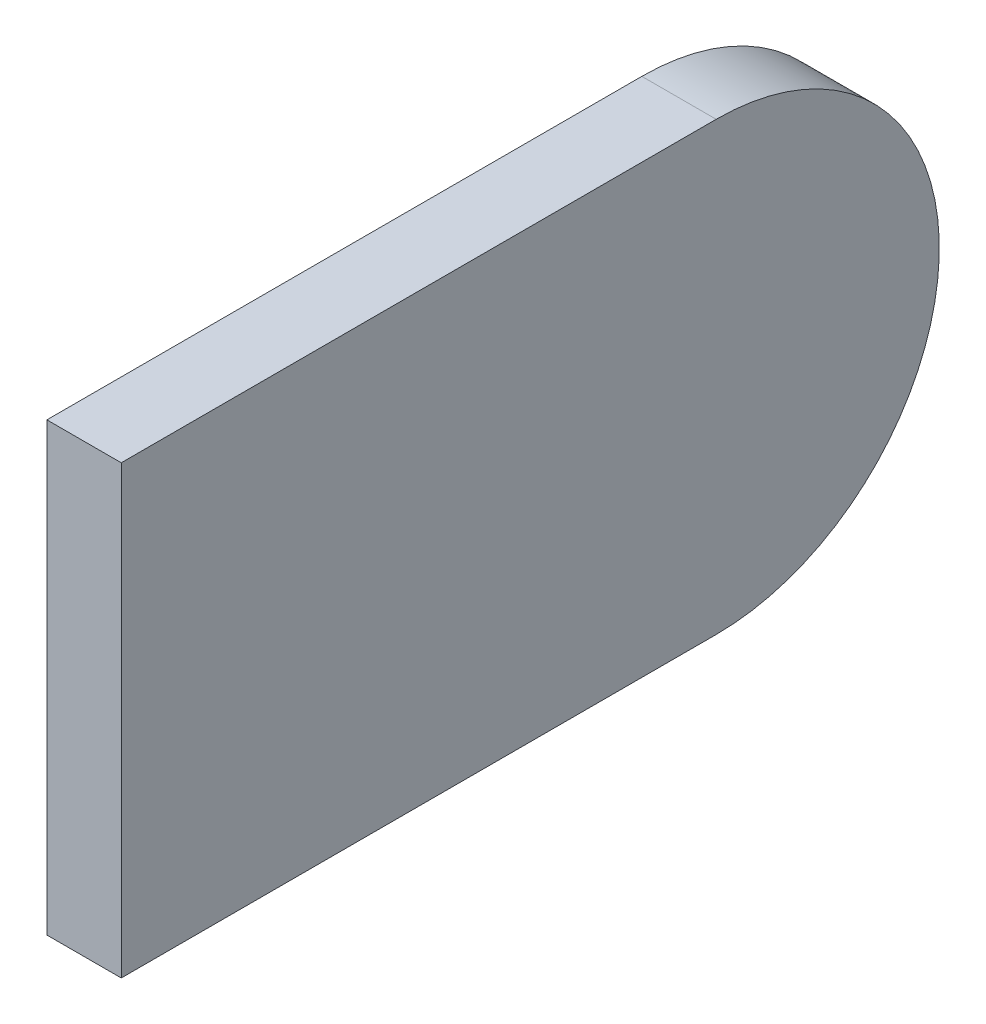
ISO-10303-21;
HEADER;
FILE_DESCRIPTION(('STEP AP214'),'2;1');
FILE_NAME('part.step','',(''),(''),'','','');
FILE_SCHEMA(('AUTOMOTIVE_DESIGN { 1 0 10303 214 1 1 1 1 }'));
ENDSEC;
DATA;
#1=APPLICATION_CONTEXT('core data for automotive mechanical design processes');
#2=APPLICATION_PROTOCOL_DEFINITION('international standard','automotive_design',2000,#1);
#3=PRODUCT_CONTEXT('',#1,'mechanical');
#4=PRODUCT('Part','Part','',(#3));
#5=PRODUCT_RELATED_PRODUCT_CATEGORY('part','',(#4));
#6=PRODUCT_DEFINITION_FORMATION('','',#4);
#7=PRODUCT_DEFINITION_CONTEXT('part definition',#1,'design');
#8=PRODUCT_DEFINITION('design','',#6,#7);
#9=PRODUCT_DEFINITION_SHAPE('','',#8);
#10=(LENGTH_UNIT() NAMED_UNIT(*) SI_UNIT(.MILLI.,.METRE.));
#11=(NAMED_UNIT(*) PLANE_ANGLE_UNIT() SI_UNIT($,.RADIAN.));
#12=(NAMED_UNIT(*) SI_UNIT($,.STERADIAN.) SOLID_ANGLE_UNIT());
#13=UNCERTAINTY_MEASURE_WITH_UNIT(LENGTH_MEASURE(1.E-05),#10,'distance_accuracy_value','');
#14=(GEOMETRIC_REPRESENTATION_CONTEXT(3) GLOBAL_UNCERTAINTY_ASSIGNED_CONTEXT((#13)) GLOBAL_UNIT_ASSIGNED_CONTEXT((#10,
#11,#12)) REPRESENTATION_CONTEXT('',''));
#15=CARTESIAN_POINT('',(0.,0.,0.));
#16=DIRECTION('',(0.,0.,1.));
#17=DIRECTION('',(1.,0.,0.));
#18=AXIS2_PLACEMENT_3D('',#15,#16,#17);
#19=CARTESIAN_POINT('',(10.,0.,-80.));
#20=DIRECTION('',(0.,1.,0.));
#21=DIRECTION('',(0.,0.,1.));
#22=AXIS2_PLACEMENT_3D('',#19,#20,#21);
#23=PLANE('',#22);
#24=DIRECTION('',(0.,0.,-1.));
#25=VECTOR('',#24,1.);
#26=CARTESIAN_POINT('',(0.,0.,-80.));
#27=LINE('',#26,#25);
#28=CARTESIAN_POINT('',(0.,0.,0.));
#29=VERTEX_POINT('',#28);
#30=CARTESIAN_POINT('',(0.,0.,-80.));
#31=VERTEX_POINT('',#30);
#32=EDGE_CURVE('E99',#29,#31,#27,.T.);
#33=ORIENTED_EDGE('',*,*,#32,.T.);
#34=DIRECTION('',(-1.,0.,0.));
#35=VECTOR('',#34,1.);
#36=CARTESIAN_POINT('',(10.,0.,-80.));
#37=LINE('',#36,#35);
#38=CARTESIAN_POINT('',(10.,0.,-80.));
#39=VERTEX_POINT('',#38);
#40=EDGE_CURVE('E11',#39,#31,#37,.T.);
#41=ORIENTED_EDGE('',*,*,#40,.F.);
#42=DIRECTION('',(0.,0.,-1.));
#43=VECTOR('',#42,1.);
#44=CARTESIAN_POINT('',(10.,0.,-80.));
#45=LINE('',#44,#43);
#46=CARTESIAN_POINT('',(10.,0.,0.));
#47=VERTEX_POINT('',#46);
#48=EDGE_CURVE('E87',#47,#39,#45,.T.);
#49=ORIENTED_EDGE('',*,*,#48,.F.);
#50=DIRECTION('',(-1.,0.,0.));
#51=VECTOR('',#50,1.);
#52=CARTESIAN_POINT('',(10.,0.,0.));
#53=LINE('',#52,#51);
#54=EDGE_CURVE('E95',#47,#29,#53,.T.);
#55=ORIENTED_EDGE('',*,*,#54,.T.);
#56=EDGE_LOOP('',(#33,#41,#49,#55));
#57=FACE_BOUND('',#56,.T.);
#58=ADVANCED_FACE('F36',(#57),#23,.F.);
#59=CARTESIAN_POINT('',(10.,30.,-80.));
#60=DIRECTION('',(-1.,0.,0.));
#61=DIRECTION('',(0.,0.,1.));
#62=AXIS2_PLACEMENT_3D('',#59,#60,#61);
#63=CYLINDRICAL_SURFACE('',#62,30.);
#64=CARTESIAN_POINT('',(0.,30.,-80.));
#65=DIRECTION('',(1.,0.,0.));
#66=DIRECTION('',(0.,0.,1.));
#67=AXIS2_PLACEMENT_3D('',#64,#65,#66);
#68=CIRCLE('',#67,30.);
#69=CARTESIAN_POINT('',(0.,60.,-80.));
#70=VERTEX_POINT('',#69);
#71=EDGE_CURVE('E91',#31,#70,#68,.T.);
#72=ORIENTED_EDGE('',*,*,#71,.T.);
#73=DIRECTION('',(-1.,0.,0.));
#74=VECTOR('',#73,1.);
#75=CARTESIAN_POINT('',(10.,60.,-80.));
#76=LINE('',#75,#74);
#77=CARTESIAN_POINT('',(10.,60.,-80.));
#78=VERTEX_POINT('',#77);
#79=EDGE_CURVE('E44',#78,#70,#76,.T.);
#80=ORIENTED_EDGE('',*,*,#79,.F.);
#81=CARTESIAN_POINT('',(10.,30.,-80.));
#82=DIRECTION('',(1.,0.,0.));
#83=DIRECTION('',(0.,0.,1.));
#84=AXIS2_PLACEMENT_3D('',#81,#82,#83);
#85=CIRCLE('',#84,30.);
#86=EDGE_CURVE('E82',#39,#78,#85,.T.);
#87=ORIENTED_EDGE('',*,*,#86,.F.);
#88=ORIENTED_EDGE('',*,*,#40,.T.);
#89=EDGE_LOOP('',(#72,#80,#87,#88));
#90=FACE_BOUND('',#89,.T.);
#91=ADVANCED_FACE('F90',(#90),#63,.T.);
#92=CARTESIAN_POINT('',(10.,60.,0.));
#93=DIRECTION('',(0.,-1.,0.));
#94=DIRECTION('',(0.,0.,-1.));
#95=AXIS2_PLACEMENT_3D('',#92,#93,#94);
#96=PLANE('',#95);
#97=DIRECTION('',(0.,0.,1.));
#98=VECTOR('',#97,1.);
#99=CARTESIAN_POINT('',(0.,60.,0.));
#100=LINE('',#99,#98);
#101=CARTESIAN_POINT('',(0.,60.,0.));
#102=VERTEX_POINT('',#101);
#103=EDGE_CURVE('E69',#70,#102,#100,.T.);
#104=ORIENTED_EDGE('',*,*,#103,.T.);
#105=DIRECTION('',(-1.,0.,0.));
#106=VECTOR('',#105,1.);
#107=CARTESIAN_POINT('',(10.,60.,0.));
#108=LINE('',#107,#106);
#109=CARTESIAN_POINT('',(10.,60.,0.));
#110=VERTEX_POINT('',#109);
#111=EDGE_CURVE('E92',#110,#102,#108,.T.);
#112=ORIENTED_EDGE('',*,*,#111,.F.);
#113=DIRECTION('',(0.,0.,1.));
#114=VECTOR('',#113,1.);
#115=CARTESIAN_POINT('',(10.,60.,0.));
#116=LINE('',#115,#114);
#117=EDGE_CURVE('E85',#78,#110,#116,.T.);
#118=ORIENTED_EDGE('',*,*,#117,.F.);
#119=ORIENTED_EDGE('',*,*,#79,.T.);
#120=EDGE_LOOP('',(#104,#112,#118,#119));
#121=FACE_BOUND('',#120,.T.);
#122=ADVANCED_FACE('F93',(#121),#96,.F.);
#123=CARTESIAN_POINT('',(10.,0.,0.));
#124=DIRECTION('',(0.,0.,-1.));
#125=DIRECTION('',(-1.,0.,0.));
#126=AXIS2_PLACEMENT_3D('',#123,#124,#125);
#127=PLANE('',#126);
#128=DIRECTION('',(0.,-1.,0.));
#129=VECTOR('',#128,1.);
#130=CARTESIAN_POINT('',(0.,0.,0.));
#131=LINE('',#130,#129);
#132=EDGE_CURVE('E75',#102,#29,#131,.T.);
#133=ORIENTED_EDGE('',*,*,#132,.T.);
#134=ORIENTED_EDGE('',*,*,#54,.F.);
#135=DIRECTION('',(0.,-1.,0.));
#136=VECTOR('',#135,1.);
#137=CARTESIAN_POINT('',(10.,0.,0.));
#138=LINE('',#137,#136);
#139=EDGE_CURVE('E52',#110,#47,#138,.T.);
#140=ORIENTED_EDGE('',*,*,#139,.F.);
#141=ORIENTED_EDGE('',*,*,#111,.T.);
#142=EDGE_LOOP('',(#133,#134,#140,#141));
#143=FACE_BOUND('',#142,.T.);
#144=ADVANCED_FACE('F106',(#143),#127,.F.);
#145=CARTESIAN_POINT('',(10.,30.,-80.));
#146=DIRECTION('',(-1.,0.,0.));
#147=DIRECTION('',(0.,0.,1.));
#148=AXIS2_PLACEMENT_3D('',#145,#146,#147);
#149=PLANE('',#148);
#150=ORIENTED_EDGE('',*,*,#48,.T.);
#151=ORIENTED_EDGE('',*,*,#86,.T.);
#152=ORIENTED_EDGE('',*,*,#117,.T.);
#153=ORIENTED_EDGE('',*,*,#139,.T.);
#154=EDGE_LOOP('',(#150,#151,#152,#153));
#155=FACE_BOUND('',#154,.T.);
#156=ADVANCED_FACE('F83',(#155),#149,.F.);
#157=CARTESIAN_POINT('',(0.,30.,-80.));
#158=DIRECTION('',(-1.,0.,0.));
#159=DIRECTION('',(0.,0.,1.));
#160=AXIS2_PLACEMENT_3D('',#157,#158,#159);
#161=PLANE('',#160);
#162=ORIENTED_EDGE('',*,*,#32,.F.);
#163=ORIENTED_EDGE('',*,*,#132,.F.);
#164=ORIENTED_EDGE('',*,*,#103,.F.);
#165=ORIENTED_EDGE('',*,*,#71,.F.);
#166=EDGE_LOOP('',(#162,#163,#164,#165));
#167=FACE_BOUND('',#166,.T.);
#168=ADVANCED_FACE('F109',(#167),#161,.T.);
#169=CLOSED_SHELL('',(#58,#91,#122,#144,#156,#168));
#170=MANIFOLD_SOLID_BREP('B2',#169);
#171=ADVANCED_BREP_SHAPE_REPRESENTATION('',(#18,#170),#14);
#172=SHAPE_DEFINITION_REPRESENTATION(#9,#171);
ENDSEC;
END-ISO-10303-21;
